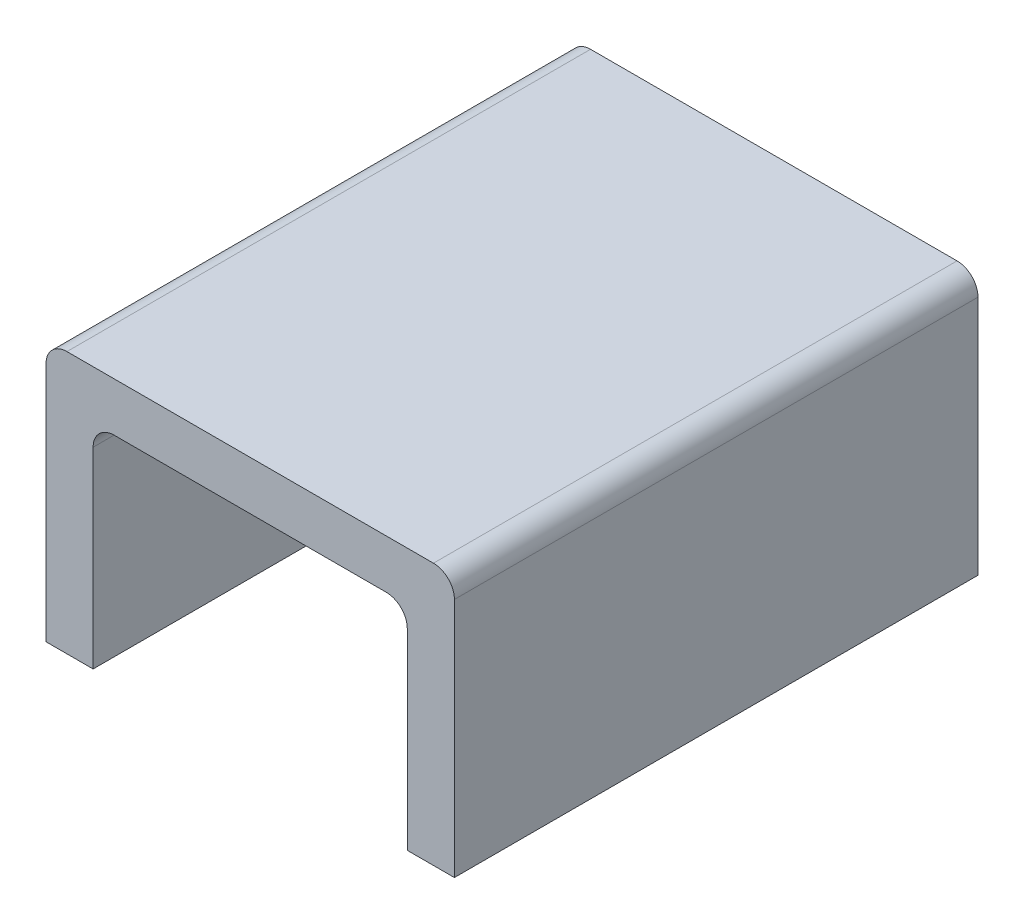
ISO-10303-21;
HEADER;
FILE_DESCRIPTION(('STEP AP214'),'2;1');
FILE_NAME('part.step','',(''),(''),'','','');
FILE_SCHEMA(('AUTOMOTIVE_DESIGN { 1 0 10303 214 1 1 1 1 }'));
ENDSEC;
DATA;
#1=APPLICATION_CONTEXT('core data for automotive mechanical design processes');
#2=APPLICATION_PROTOCOL_DEFINITION('international standard','automotive_design',2000,#1);
#3=PRODUCT_CONTEXT('',#1,'mechanical');
#4=PRODUCT('Part','Part','',(#3));
#5=PRODUCT_RELATED_PRODUCT_CATEGORY('part','',(#4));
#6=PRODUCT_DEFINITION_FORMATION('','',#4);
#7=PRODUCT_DEFINITION_CONTEXT('part definition',#1,'design');
#8=PRODUCT_DEFINITION('design','',#6,#7);
#9=PRODUCT_DEFINITION_SHAPE('','',#8);
#10=(LENGTH_UNIT() NAMED_UNIT(*) SI_UNIT(.MILLI.,.METRE.));
#11=(NAMED_UNIT(*) PLANE_ANGLE_UNIT() SI_UNIT($,.RADIAN.));
#12=(NAMED_UNIT(*) SI_UNIT($,.STERADIAN.) SOLID_ANGLE_UNIT());
#13=UNCERTAINTY_MEASURE_WITH_UNIT(LENGTH_MEASURE(1.E-05),#10,'distance_accuracy_value','');
#14=(GEOMETRIC_REPRESENTATION_CONTEXT(3) GLOBAL_UNCERTAINTY_ASSIGNED_CONTEXT((#13)) GLOBAL_UNIT_ASSIGNED_CONTEXT((#10,
#11,#12)) REPRESENTATION_CONTEXT('',''));
#15=CARTESIAN_POINT('',(0.,0.,0.));
#16=DIRECTION('',(0.,0.,1.));
#17=DIRECTION('',(1.,0.,0.));
#18=AXIS2_PLACEMENT_3D('',#15,#16,#17);
#19=CARTESIAN_POINT('',(-28.125,-13.9204545454545,50.));
#20=DIRECTION('',(0.,1.,0.));
#21=DIRECTION('',(0.,0.,1.));
#22=AXIS2_PLACEMENT_3D('',#19,#20,#21);
#23=PLANE('',#22);
#24=DIRECTION('',(1.,0.,0.));
#25=VECTOR('',#24,1.);
#26=CARTESIAN_POINT('',(-28.125,-13.9204545454545,0.));
#27=LINE('',#26,#25);
#28=CARTESIAN_POINT('',(-32.625,-13.9204545454545,0.));
#29=VERTEX_POINT('',#28);
#30=CARTESIAN_POINT('',(-28.125,-13.9204545454545,0.));
#31=VERTEX_POINT('',#30);
#32=EDGE_CURVE('E165',#29,#31,#27,.T.);
#33=ORIENTED_EDGE('',*,*,#32,.T.);
#34=DIRECTION('',(0.,0.,-1.));
#35=VECTOR('',#34,1.);
#36=CARTESIAN_POINT('',(-28.125,-13.9204545454545,50.));
#37=LINE('',#36,#35);
#38=CARTESIAN_POINT('',(-28.125,-13.9204545454545,50.));
#39=VERTEX_POINT('',#38);
#40=EDGE_CURVE('E49',#39,#31,#37,.T.);
#41=ORIENTED_EDGE('',*,*,#40,.F.);
#42=DIRECTION('',(1.,0.,0.));
#43=VECTOR('',#42,1.);
#44=CARTESIAN_POINT('',(-28.125,-13.9204545454545,50.));
#45=LINE('',#44,#43);
#46=CARTESIAN_POINT('',(-32.625,-13.9204545454545,50.));
#47=VERTEX_POINT('',#46);
#48=EDGE_CURVE('E113',#47,#39,#45,.T.);
#49=ORIENTED_EDGE('',*,*,#48,.F.);
#50=DIRECTION('',(0.,0.,-1.));
#51=VECTOR('',#50,1.);
#52=CARTESIAN_POINT('',(-32.625,-13.9204545454545,50.));
#53=LINE('',#52,#51);
#54=EDGE_CURVE('E11',#47,#29,#53,.T.);
#55=ORIENTED_EDGE('',*,*,#54,.T.);
#56=EDGE_LOOP('',(#33,#41,#49,#55));
#57=FACE_BOUND('',#56,.T.);
#58=ADVANCED_FACE('F41',(#57),#23,.F.);
#59=CARTESIAN_POINT('',(-28.125,4.42045454545456,50.));
#60=DIRECTION('',(-1.,0.,0.));
#61=DIRECTION('',(0.,0.,1.));
#62=AXIS2_PLACEMENT_3D('',#59,#60,#61);
#63=PLANE('',#62);
#64=DIRECTION('',(0.,1.,0.));
#65=VECTOR('',#64,1.);
#66=CARTESIAN_POINT('',(-28.125,4.42045454545456,0.));
#67=LINE('',#66,#65);
#68=CARTESIAN_POINT('',(-28.125,4.42045454545456,0.));
#69=VERTEX_POINT('',#68);
#70=EDGE_CURVE('E167',#31,#69,#67,.T.);
#71=ORIENTED_EDGE('',*,*,#70,.T.);
#72=DIRECTION('',(0.,0.,-1.));
#73=VECTOR('',#72,1.);
#74=CARTESIAN_POINT('',(-28.125,4.42045454545456,50.));
#75=LINE('',#74,#73);
#76=CARTESIAN_POINT('',(-28.125,4.42045454545456,50.));
#77=VERTEX_POINT('',#76);
#78=EDGE_CURVE('E204',#77,#69,#75,.T.);
#79=ORIENTED_EDGE('',*,*,#78,.F.);
#80=DIRECTION('',(0.,1.,0.));
#81=VECTOR('',#80,1.);
#82=CARTESIAN_POINT('',(-28.125,4.42045454545456,50.));
#83=LINE('',#82,#81);
#84=EDGE_CURVE('E212',#39,#77,#83,.T.);
#85=ORIENTED_EDGE('',*,*,#84,.F.);
#86=ORIENTED_EDGE('',*,*,#40,.T.);
#87=EDGE_LOOP('',(#71,#79,#85,#86));
#88=FACE_BOUND('',#87,.T.);
#89=ADVANCED_FACE('F210',(#88),#63,.F.);
#90=CARTESIAN_POINT('',(-26.125,4.42045454545456,50.));
#91=DIRECTION('',(0.,0.,-1.));
#92=DIRECTION('',(-1.,0.,0.));
#93=AXIS2_PLACEMENT_3D('',#90,#91,#92);
#94=CYLINDRICAL_SURFACE('',#93,2.);
#95=CARTESIAN_POINT('',(-26.125,4.42045454545456,0.));
#96=DIRECTION('',(0.,0.,-1.));
#97=DIRECTION('',(1.,0.,0.));
#98=AXIS2_PLACEMENT_3D('',#95,#96,#97);
#99=CIRCLE('',#98,2.);
#100=CARTESIAN_POINT('',(-26.125,6.42045454545456,0.));
#101=VERTEX_POINT('',#100);
#102=EDGE_CURVE('E169',#69,#101,#99,.T.);
#103=ORIENTED_EDGE('',*,*,#102,.T.);
#104=DIRECTION('',(0.,0.,-1.));
#105=VECTOR('',#104,1.);
#106=CARTESIAN_POINT('',(-26.125,6.42045454545456,50.));
#107=LINE('',#106,#105);
#108=CARTESIAN_POINT('',(-26.125,6.42045454545456,50.));
#109=VERTEX_POINT('',#108);
#110=EDGE_CURVE('E201',#109,#101,#107,.T.);
#111=ORIENTED_EDGE('',*,*,#110,.F.);
#112=CARTESIAN_POINT('',(-26.125,4.42045454545456,50.));
#113=DIRECTION('',(0.,0.,-1.));
#114=DIRECTION('',(1.,0.,0.));
#115=AXIS2_PLACEMENT_3D('',#112,#113,#114);
#116=CIRCLE('',#115,2.);
#117=EDGE_CURVE('E231',#77,#109,#116,.T.);
#118=ORIENTED_EDGE('',*,*,#117,.F.);
#119=ORIENTED_EDGE('',*,*,#78,.T.);
#120=EDGE_LOOP('',(#103,#111,#118,#119));
#121=FACE_BOUND('',#120,.T.);
#122=ADVANCED_FACE('F222',(#121),#94,.F.);
#123=CARTESIAN_POINT('',(-0.125000000000006,6.42045454545456,50.));
#124=DIRECTION('',(0.,1.,0.));
#125=DIRECTION('',(0.,0.,1.));
#126=AXIS2_PLACEMENT_3D('',#123,#124,#125);
#127=PLANE('',#126);
#128=DIRECTION('',(1.,0.,0.));
#129=VECTOR('',#128,1.);
#130=CARTESIAN_POINT('',(-0.125000000000006,6.42045454545456,0.));
#131=LINE('',#130,#129);
#132=CARTESIAN_POINT('',(-0.125000000000006,6.42045454545456,0.));
#133=VERTEX_POINT('',#132);
#134=EDGE_CURVE('E171',#101,#133,#131,.T.);
#135=ORIENTED_EDGE('',*,*,#134,.T.);
#136=DIRECTION('',(0.,0.,-1.));
#137=VECTOR('',#136,1.);
#138=CARTESIAN_POINT('',(-0.125000000000006,6.42045454545456,50.));
#139=LINE('',#138,#137);
#140=CARTESIAN_POINT('',(-0.125000000000006,6.42045454545456,50.));
#141=VERTEX_POINT('',#140);
#142=EDGE_CURVE('E198',#141,#133,#139,.T.);
#143=ORIENTED_EDGE('',*,*,#142,.F.);
#144=DIRECTION('',(1.,0.,0.));
#145=VECTOR('',#144,1.);
#146=CARTESIAN_POINT('',(-0.125000000000006,6.42045454545456,50.));
#147=LINE('',#146,#145);
#148=EDGE_CURVE('E228',#109,#141,#147,.T.);
#149=ORIENTED_EDGE('',*,*,#148,.F.);
#150=ORIENTED_EDGE('',*,*,#110,.T.);
#151=EDGE_LOOP('',(#135,#143,#149,#150));
#152=FACE_BOUND('',#151,.T.);
#153=ADVANCED_FACE('F226',(#152),#127,.F.);
#154=CARTESIAN_POINT('',(-0.125000000000006,4.42045454545456,50.));
#155=DIRECTION('',(0.,0.,-1.));
#156=DIRECTION('',(-1.,0.,0.));
#157=AXIS2_PLACEMENT_3D('',#154,#155,#156);
#158=CYLINDRICAL_SURFACE('',#157,2.);
#159=CARTESIAN_POINT('',(-0.125000000000006,4.42045454545456,0.));
#160=DIRECTION('',(0.,0.,-1.));
#161=DIRECTION('',(1.,0.,0.));
#162=AXIS2_PLACEMENT_3D('',#159,#160,#161);
#163=CIRCLE('',#162,2.);
#164=CARTESIAN_POINT('',(1.87499999999999,4.42045454545456,0.));
#165=VERTEX_POINT('',#164);
#166=EDGE_CURVE('E173',#133,#165,#163,.T.);
#167=ORIENTED_EDGE('',*,*,#166,.T.);
#168=DIRECTION('',(0.,0.,-1.));
#169=VECTOR('',#168,1.);
#170=CARTESIAN_POINT('',(1.87499999999999,4.42045454545456,50.));
#171=LINE('',#170,#169);
#172=CARTESIAN_POINT('',(1.87499999999999,4.42045454545456,50.));
#173=VERTEX_POINT('',#172);
#174=EDGE_CURVE('E195',#173,#165,#171,.T.);
#175=ORIENTED_EDGE('',*,*,#174,.F.);
#176=CARTESIAN_POINT('',(-0.125000000000006,4.42045454545456,50.));
#177=DIRECTION('',(0.,0.,-1.));
#178=DIRECTION('',(1.,0.,0.));
#179=AXIS2_PLACEMENT_3D('',#176,#177,#178);
#180=CIRCLE('',#179,2.);
#181=EDGE_CURVE('E230',#141,#173,#180,.T.);
#182=ORIENTED_EDGE('',*,*,#181,.F.);
#183=ORIENTED_EDGE('',*,*,#142,.T.);
#184=EDGE_LOOP('',(#167,#175,#182,#183));
#185=FACE_BOUND('',#184,.T.);
#186=ADVANCED_FACE('F273',(#185),#158,.F.);
#187=CARTESIAN_POINT('',(1.87499999999999,-13.9204545454545,50.));
#188=DIRECTION('',(1.,0.,0.));
#189=DIRECTION('',(0.,1.,0.));
#190=AXIS2_PLACEMENT_3D('',#187,#188,#189);
#191=PLANE('',#190);
#192=DIRECTION('',(0.,-1.,0.));
#193=VECTOR('',#192,1.);
#194=CARTESIAN_POINT('',(1.87499999999999,-13.9204545454545,0.));
#195=LINE('',#194,#193);
#196=CARTESIAN_POINT('',(1.87499999999999,-13.9204545454545,0.));
#197=VERTEX_POINT('',#196);
#198=EDGE_CURVE('E175',#165,#197,#195,.T.);
#199=ORIENTED_EDGE('',*,*,#198,.T.);
#200=DIRECTION('',(0.,0.,-1.));
#201=VECTOR('',#200,1.);
#202=CARTESIAN_POINT('',(1.87499999999999,-13.9204545454545,50.));
#203=LINE('',#202,#201);
#204=CARTESIAN_POINT('',(1.87499999999999,-13.9204545454545,50.));
#205=VERTEX_POINT('',#204);
#206=EDGE_CURVE('E192',#205,#197,#203,.T.);
#207=ORIENTED_EDGE('',*,*,#206,.F.);
#208=DIRECTION('',(0.,-1.,0.));
#209=VECTOR('',#208,1.);
#210=CARTESIAN_POINT('',(1.87499999999999,-13.9204545454545,50.));
#211=LINE('',#210,#209);
#212=EDGE_CURVE('E233',#173,#205,#211,.T.);
#213=ORIENTED_EDGE('',*,*,#212,.F.);
#214=ORIENTED_EDGE('',*,*,#174,.T.);
#215=EDGE_LOOP('',(#199,#207,#213,#214));
#216=FACE_BOUND('',#215,.T.);
#217=ADVANCED_FACE('F276',(#216),#191,.F.);
#218=CARTESIAN_POINT('',(6.375,-13.9204545454545,50.));
#219=DIRECTION('',(0.,1.,0.));
#220=DIRECTION('',(-1.,0.,0.));
#221=AXIS2_PLACEMENT_3D('',#218,#219,#220);
#222=PLANE('',#221);
#223=DIRECTION('',(1.,0.,0.));
#224=VECTOR('',#223,1.);
#225=CARTESIAN_POINT('',(6.375,-13.9204545454545,0.));
#226=LINE('',#225,#224);
#227=CARTESIAN_POINT('',(6.375,-13.9204545454545,0.));
#228=VERTEX_POINT('',#227);
#229=EDGE_CURVE('E177',#197,#228,#226,.T.);
#230=ORIENTED_EDGE('',*,*,#229,.T.);
#231=DIRECTION('',(0.,0.,-1.));
#232=VECTOR('',#231,1.);
#233=CARTESIAN_POINT('',(6.375,-13.9204545454545,50.));
#234=LINE('',#233,#232);
#235=CARTESIAN_POINT('',(6.375,-13.9204545454545,50.));
#236=VERTEX_POINT('',#235);
#237=EDGE_CURVE('E189',#236,#228,#234,.T.);
#238=ORIENTED_EDGE('',*,*,#237,.F.);
#239=DIRECTION('',(1.,0.,0.));
#240=VECTOR('',#239,1.);
#241=CARTESIAN_POINT('',(6.375,-13.9204545454545,50.));
#242=LINE('',#241,#240);
#243=EDGE_CURVE('E239',#205,#236,#242,.T.);
#244=ORIENTED_EDGE('',*,*,#243,.F.);
#245=ORIENTED_EDGE('',*,*,#206,.T.);
#246=EDGE_LOOP('',(#230,#238,#244,#245));
#247=FACE_BOUND('',#246,.T.);
#248=ADVANCED_FACE('F245',(#247),#222,.F.);
#249=CARTESIAN_POINT('',(6.375,9.07954545454546,50.));
#250=DIRECTION('',(-1.,0.,0.));
#251=DIRECTION('',(0.,0.,1.));
#252=AXIS2_PLACEMENT_3D('',#249,#250,#251);
#253=PLANE('',#252);
#254=DIRECTION('',(0.,1.,0.));
#255=VECTOR('',#254,1.);
#256=CARTESIAN_POINT('',(6.375,9.07954545454546,0.));
#257=LINE('',#256,#255);
#258=CARTESIAN_POINT('',(6.375,9.07954545454546,0.));
#259=VERTEX_POINT('',#258);
#260=EDGE_CURVE('E179',#228,#259,#257,.T.);
#261=ORIENTED_EDGE('',*,*,#260,.T.);
#262=DIRECTION('',(0.,0.,-1.));
#263=VECTOR('',#262,1.);
#264=CARTESIAN_POINT('',(6.375,9.07954545454546,50.));
#265=LINE('',#264,#263);
#266=CARTESIAN_POINT('',(6.375,9.07954545454546,50.));
#267=VERTEX_POINT('',#266);
#268=EDGE_CURVE('E154',#267,#259,#265,.T.);
#269=ORIENTED_EDGE('',*,*,#268,.F.);
#270=DIRECTION('',(0.,1.,0.));
#271=VECTOR('',#270,1.);
#272=CARTESIAN_POINT('',(6.375,9.07954545454546,50.));
#273=LINE('',#272,#271);
#274=EDGE_CURVE('E145',#236,#267,#273,.T.);
#275=ORIENTED_EDGE('',*,*,#274,.F.);
#276=ORIENTED_EDGE('',*,*,#237,.T.);
#277=EDGE_LOOP('',(#261,#269,#275,#276));
#278=FACE_BOUND('',#277,.T.);
#279=ADVANCED_FACE('F249',(#278),#253,.F.);
#280=CARTESIAN_POINT('',(4.375,9.07954545454546,50.));
#281=DIRECTION('',(0.,0.,-1.));
#282=DIRECTION('',(-1.,0.,0.));
#283=AXIS2_PLACEMENT_3D('',#280,#281,#282);
#284=CYLINDRICAL_SURFACE('',#283,2.);
#285=CARTESIAN_POINT('',(4.375,9.07954545454546,0.));
#286=DIRECTION('',(0.,0.,1.));
#287=DIRECTION('',(-1.,0.,0.));
#288=AXIS2_PLACEMENT_3D('',#285,#286,#287);
#289=CIRCLE('',#288,2.);
#290=CARTESIAN_POINT('',(4.375,11.0795454545455,0.));
#291=VERTEX_POINT('',#290);
#292=EDGE_CURVE('E153',#259,#291,#289,.T.);
#293=ORIENTED_EDGE('',*,*,#292,.T.);
#294=DIRECTION('',(0.,0.,-1.));
#295=VECTOR('',#294,1.);
#296=CARTESIAN_POINT('',(4.375,11.0795454545455,50.));
#297=LINE('',#296,#295);
#298=CARTESIAN_POINT('',(4.375,11.0795454545455,50.));
#299=VERTEX_POINT('',#298);
#300=EDGE_CURVE('E150',#299,#291,#297,.T.);
#301=ORIENTED_EDGE('',*,*,#300,.F.);
#302=CARTESIAN_POINT('',(4.375,9.07954545454546,50.));
#303=DIRECTION('',(0.,0.,1.));
#304=DIRECTION('',(-1.,0.,0.));
#305=AXIS2_PLACEMENT_3D('',#302,#303,#304);
#306=CIRCLE('',#305,2.);
#307=EDGE_CURVE('E139',#267,#299,#306,.T.);
#308=ORIENTED_EDGE('',*,*,#307,.F.);
#309=ORIENTED_EDGE('',*,*,#268,.T.);
#310=EDGE_LOOP('',(#293,#301,#308,#309));
#311=FACE_BOUND('',#310,.T.);
#312=ADVANCED_FACE('F151',(#311),#284,.T.);
#313=CARTESIAN_POINT('',(-30.625,11.0795454545455,50.));
#314=DIRECTION('',(0.,-1.,0.));
#315=DIRECTION('',(0.,0.,-1.));
#316=AXIS2_PLACEMENT_3D('',#313,#314,#315);
#317=PLANE('',#316);
#318=DIRECTION('',(-1.,0.,0.));
#319=VECTOR('',#318,1.);
#320=CARTESIAN_POINT('',(-30.625,11.0795454545455,0.));
#321=LINE('',#320,#319);
#322=CARTESIAN_POINT('',(-30.625,11.0795454545455,0.));
#323=VERTEX_POINT('',#322);
#324=EDGE_CURVE('E99',#291,#323,#321,.T.);
#325=ORIENTED_EDGE('',*,*,#324,.T.);
#326=DIRECTION('',(0.,0.,-1.));
#327=VECTOR('',#326,1.);
#328=CARTESIAN_POINT('',(-30.625,11.0795454545455,50.));
#329=LINE('',#328,#327);
#330=CARTESIAN_POINT('',(-30.625,11.0795454545455,50.));
#331=VERTEX_POINT('',#330);
#332=EDGE_CURVE('E155',#331,#323,#329,.T.);
#333=ORIENTED_EDGE('',*,*,#332,.F.);
#334=DIRECTION('',(-1.,0.,0.));
#335=VECTOR('',#334,1.);
#336=CARTESIAN_POINT('',(-30.625,11.0795454545455,50.));
#337=LINE('',#336,#335);
#338=EDGE_CURVE('E143',#299,#331,#337,.T.);
#339=ORIENTED_EDGE('',*,*,#338,.F.);
#340=ORIENTED_EDGE('',*,*,#300,.T.);
#341=EDGE_LOOP('',(#325,#333,#339,#340));
#342=FACE_BOUND('',#341,.T.);
#343=ADVANCED_FACE('F157',(#342),#317,.F.);
#344=CARTESIAN_POINT('',(-30.625,9.07954545454546,50.));
#345=DIRECTION('',(0.,0.,-1.));
#346=DIRECTION('',(-1.,0.,0.));
#347=AXIS2_PLACEMENT_3D('',#344,#345,#346);
#348=CYLINDRICAL_SURFACE('',#347,2.);
#349=CARTESIAN_POINT('',(-30.625,9.07954545454546,0.));
#350=DIRECTION('',(0.,0.,1.));
#351=DIRECTION('',(-1.,0.,0.));
#352=AXIS2_PLACEMENT_3D('',#349,#350,#351);
#353=CIRCLE('',#352,2.);
#354=CARTESIAN_POINT('',(-32.625,9.07954545454546,0.));
#355=VERTEX_POINT('',#354);
#356=EDGE_CURVE('E106',#323,#355,#353,.T.);
#357=ORIENTED_EDGE('',*,*,#356,.T.);
#358=DIRECTION('',(0.,0.,-1.));
#359=VECTOR('',#358,1.);
#360=CARTESIAN_POINT('',(-32.625,9.07954545454546,50.));
#361=LINE('',#360,#359);
#362=CARTESIAN_POINT('',(-32.625,9.07954545454546,50.));
#363=VERTEX_POINT('',#362);
#364=EDGE_CURVE('E161',#363,#355,#361,.T.);
#365=ORIENTED_EDGE('',*,*,#364,.F.);
#366=CARTESIAN_POINT('',(-30.625,9.07954545454546,50.));
#367=DIRECTION('',(0.,0.,1.));
#368=DIRECTION('',(-1.,0.,0.));
#369=AXIS2_PLACEMENT_3D('',#366,#367,#368);
#370=CIRCLE('',#369,2.);
#371=EDGE_CURVE('E159',#331,#363,#370,.T.);
#372=ORIENTED_EDGE('',*,*,#371,.F.);
#373=ORIENTED_EDGE('',*,*,#332,.T.);
#374=EDGE_LOOP('',(#357,#365,#372,#373));
#375=FACE_BOUND('',#374,.T.);
#376=ADVANCED_FACE('F251',(#375),#348,.T.);
#377=CARTESIAN_POINT('',(-32.625,-8.92045454545454,50.));
#378=DIRECTION('',(1.,0.,0.));
#379=DIRECTION('',(0.,0.,-1.));
#380=AXIS2_PLACEMENT_3D('',#377,#378,#379);
#381=PLANE('',#380);
#382=DIRECTION('',(0.,-1.,0.));
#383=VECTOR('',#382,1.);
#384=CARTESIAN_POINT('',(-32.625,-8.92045454545454,0.));
#385=LINE('',#384,#383);
#386=EDGE_CURVE('E184',#355,#29,#385,.T.);
#387=ORIENTED_EDGE('',*,*,#386,.T.);
#388=ORIENTED_EDGE('',*,*,#54,.F.);
#389=DIRECTION('',(0.,-1.,0.));
#390=VECTOR('',#389,1.);
#391=CARTESIAN_POINT('',(-32.625,-13.9204545454545,50.));
#392=LINE('',#391,#390);
#393=EDGE_CURVE('E57',#363,#47,#392,.T.);
#394=ORIENTED_EDGE('',*,*,#393,.F.);
#395=ORIENTED_EDGE('',*,*,#364,.T.);
#396=EDGE_LOOP('',(#387,#388,#394,#395));
#397=FACE_BOUND('',#396,.T.);
#398=ADVANCED_FACE('F250',(#397),#381,.F.);
#399=CARTESIAN_POINT('',(-30.625,9.07954545454546,50.));
#400=DIRECTION('',(0.,0.,-1.));
#401=DIRECTION('',(-1.,0.,0.));
#402=AXIS2_PLACEMENT_3D('',#399,#400,#401);
#403=PLANE('',#402);
#404=ORIENTED_EDGE('',*,*,#393,.T.);
#405=ORIENTED_EDGE('',*,*,#48,.T.);
#406=ORIENTED_EDGE('',*,*,#84,.T.);
#407=ORIENTED_EDGE('',*,*,#117,.T.);
#408=ORIENTED_EDGE('',*,*,#148,.T.);
#409=ORIENTED_EDGE('',*,*,#181,.T.);
#410=ORIENTED_EDGE('',*,*,#212,.T.);
#411=ORIENTED_EDGE('',*,*,#243,.T.);
#412=ORIENTED_EDGE('',*,*,#274,.T.);
#413=ORIENTED_EDGE('',*,*,#307,.T.);
#414=ORIENTED_EDGE('',*,*,#338,.T.);
#415=ORIENTED_EDGE('',*,*,#371,.T.);
#416=EDGE_LOOP('',(#404,#405,#406,#407,#408,#409,#410,#411,#412,#413,#414,#415));
#417=FACE_BOUND('',#416,.T.);
#418=ADVANCED_FACE('F141',(#417),#403,.F.);
#419=CARTESIAN_POINT('',(-30.625,9.07954545454546,0.));
#420=DIRECTION('',(0.,0.,-1.));
#421=DIRECTION('',(-1.,0.,0.));
#422=AXIS2_PLACEMENT_3D('',#419,#420,#421);
#423=PLANE('',#422);
#424=ORIENTED_EDGE('',*,*,#32,.F.);
#425=ORIENTED_EDGE('',*,*,#386,.F.);
#426=ORIENTED_EDGE('',*,*,#356,.F.);
#427=ORIENTED_EDGE('',*,*,#324,.F.);
#428=ORIENTED_EDGE('',*,*,#292,.F.);
#429=ORIENTED_EDGE('',*,*,#260,.F.);
#430=ORIENTED_EDGE('',*,*,#229,.F.);
#431=ORIENTED_EDGE('',*,*,#198,.F.);
#432=ORIENTED_EDGE('',*,*,#166,.F.);
#433=ORIENTED_EDGE('',*,*,#134,.F.);
#434=ORIENTED_EDGE('',*,*,#102,.F.);
#435=ORIENTED_EDGE('',*,*,#70,.F.);
#436=EDGE_LOOP('',(#424,#425,#426,#427,#428,#429,#430,#431,#432,#433,#434,#435));
#437=FACE_BOUND('',#436,.T.);
#438=ADVANCED_FACE('F216',(#437),#423,.T.);
#439=CLOSED_SHELL('',(#58,#89,#122,#153,#186,#217,#248,#279,#312,#343,#376,#398,#418,#438));
#440=MANIFOLD_SOLID_BREP('B2',#439);
#441=ADVANCED_BREP_SHAPE_REPRESENTATION('',(#18,#440),#14);
#442=SHAPE_DEFINITION_REPRESENTATION(#9,#441);
ENDSEC;
END-ISO-10303-21;
